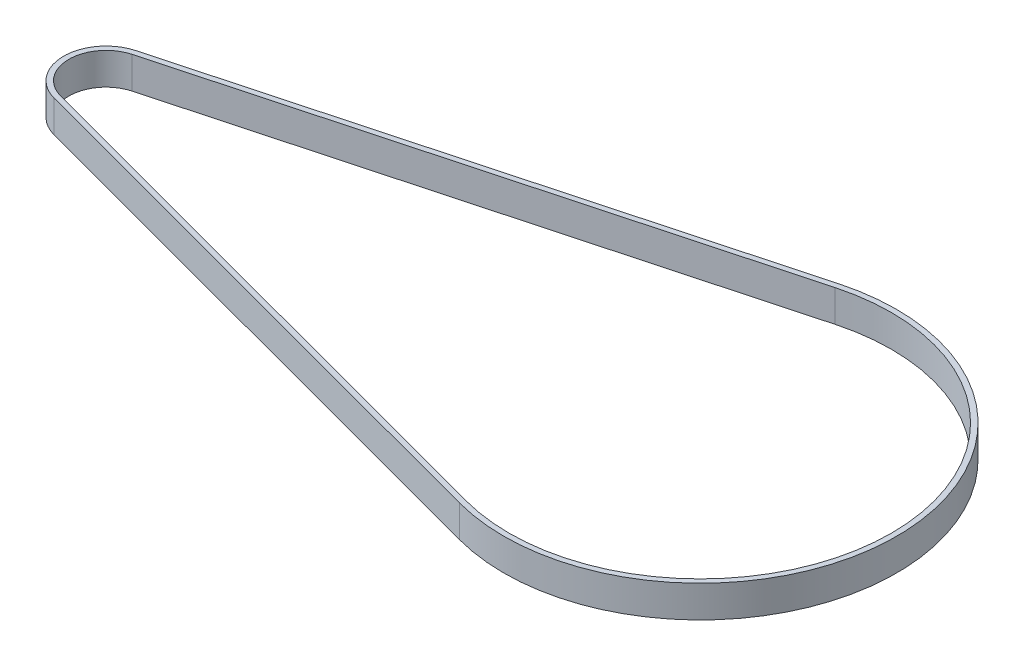
ISO-10303-21;
HEADER;
FILE_DESCRIPTION(('STEP AP214'),'2;1');
FILE_NAME('part.step','',(''),(''),'','','');
FILE_SCHEMA(('AUTOMOTIVE_DESIGN { 1 0 10303 214 1 1 1 1 }'));
ENDSEC;
DATA;
#1=APPLICATION_CONTEXT('core data for automotive mechanical design processes');
#2=APPLICATION_PROTOCOL_DEFINITION('international standard','automotive_design',2000,#1);
#3=PRODUCT_CONTEXT('',#1,'mechanical');
#4=PRODUCT('Part','Part','',(#3));
#5=PRODUCT_RELATED_PRODUCT_CATEGORY('part','',(#4));
#6=PRODUCT_DEFINITION_FORMATION('','',#4);
#7=PRODUCT_DEFINITION_CONTEXT('part definition',#1,'design');
#8=PRODUCT_DEFINITION('design','',#6,#7);
#9=PRODUCT_DEFINITION_SHAPE('','',#8);
#10=(LENGTH_UNIT() NAMED_UNIT(*) SI_UNIT(.MILLI.,.METRE.));
#11=(NAMED_UNIT(*) PLANE_ANGLE_UNIT() SI_UNIT($,.RADIAN.));
#12=(NAMED_UNIT(*) SI_UNIT($,.STERADIAN.) SOLID_ANGLE_UNIT());
#13=UNCERTAINTY_MEASURE_WITH_UNIT(LENGTH_MEASURE(1.E-05),#10,'distance_accuracy_value','');
#14=(GEOMETRIC_REPRESENTATION_CONTEXT(3) GLOBAL_UNCERTAINTY_ASSIGNED_CONTEXT((#13)) GLOBAL_UNIT_ASSIGNED_CONTEXT((#10,
#11,#12)) REPRESENTATION_CONTEXT('',''));
#15=CARTESIAN_POINT('',(0.,0.,0.));
#16=DIRECTION('',(0.,0.,1.));
#17=DIRECTION('',(1.,0.,0.));
#18=AXIS2_PLACEMENT_3D('',#15,#16,#17);
#19=CARTESIAN_POINT('',(-1.54588570592854,6.,-7.7839677512394));
#20=DIRECTION('',(-0.260781956269072,0.,-0.965397726993634));
#21=DIRECTION('',(-0.965397726993634,0.,0.260781956269072));
#22=AXIS2_PLACEMENT_3D('',#19,#20,#21);
#23=PLANE('',#22);
#24=DIRECTION('',(0.965397726993634,0.,-0.260781956269072));
#25=VECTOR('',#24,1.);
#26=CARTESIAN_POINT('',(-1.54588570592854,0.,-7.7839677512394));
#27=LINE('',#26,#25);
#28=CARTESIAN_POINT('',(-1.54588570592854,0.,-7.7839677512394));
#29=VERTEX_POINT('',#28);
#30=CARTESIAN_POINT('',(102.650740529448,0.,-35.9305018340548));
#31=VERTEX_POINT('',#30);
#32=EDGE_CURVE('E157',#29,#31,#27,.T.);
#33=ORIENTED_EDGE('',*,*,#32,.F.);
#34=DIRECTION('',(0.,-1.,0.));
#35=VECTOR('',#34,1.);
#36=CARTESIAN_POINT('',(-1.54588570592854,6.,-7.7839677512394));
#37=LINE('',#36,#35);
#38=CARTESIAN_POINT('',(-1.54588570592854,6.,-7.7839677512394));
#39=VERTEX_POINT('',#38);
#40=EDGE_CURVE('E12',#39,#29,#37,.T.);
#41=ORIENTED_EDGE('',*,*,#40,.F.);
#42=DIRECTION('',(0.965397726993634,0.,-0.260781956269072));
#43=VECTOR('',#42,1.);
#44=CARTESIAN_POINT('',(-1.54588570592854,6.,-7.7839677512394));
#45=LINE('',#44,#43);
#46=CARTESIAN_POINT('',(102.650740529448,6.,-35.9305018340548));
#47=VERTEX_POINT('',#46);
#48=EDGE_CURVE('E161',#39,#47,#45,.T.);
#49=ORIENTED_EDGE('',*,*,#48,.T.);
#50=DIRECTION('',(0.,-1.,0.));
#51=VECTOR('',#50,1.);
#52=CARTESIAN_POINT('',(102.650740529448,6.,-35.9305018340548));
#53=LINE('',#52,#51);
#54=EDGE_CURVE('E64',#47,#31,#53,.T.);
#55=ORIENTED_EDGE('',*,*,#54,.T.);
#56=EDGE_LOOP('',(#33,#41,#49,#55));
#57=FACE_BOUND('',#56,.T.);
#58=ADVANCED_FACE('F61',(#57),#23,.T.);
#59=CARTESIAN_POINT('',(0.540369944224031,6.,-0.0607859352903216));
#60=DIRECTION('',(0.,-1.,0.));
#61=DIRECTION('',(0.,0.,-1.));
#62=AXIS2_PLACEMENT_3D('',#59,#60,#61);
#63=CYLINDRICAL_SURFACE('',#62,8.);
#64=CARTESIAN_POINT('',(0.540369944224031,0.,-0.0607859352903216));
#65=DIRECTION('',(0.,1.,0.));
#66=DIRECTION('',(0.,0.,1.));
#67=AXIS2_PLACEMENT_3D('',#64,#65,#66);
#68=CIRCLE('',#67,8.);
#69=CARTESIAN_POINT('',(-1.52514657870649,0.,7.66796826532319));
#70=VERTEX_POINT('',#69);
#71=EDGE_CURVE('E165',#29,#70,#68,.T.);
#72=ORIENTED_EDGE('',*,*,#71,.T.);
#73=DIRECTION('',(0.,-1.,0.));
#74=VECTOR('',#73,1.);
#75=CARTESIAN_POINT('',(-1.52514657870649,6.,7.66796826532319));
#76=LINE('',#75,#74);
#77=CARTESIAN_POINT('',(-1.52514657870649,6.,7.66796826532319));
#78=VERTEX_POINT('',#77);
#79=EDGE_CURVE('E69',#78,#70,#76,.T.);
#80=ORIENTED_EDGE('',*,*,#79,.F.);
#81=CARTESIAN_POINT('',(0.540369944224031,6.,-0.0607859352903216));
#82=DIRECTION('',(0.,1.,0.));
#83=DIRECTION('',(0.,0.,1.));
#84=AXIS2_PLACEMENT_3D('',#81,#82,#83);
#85=CIRCLE('',#84,8.);
#86=EDGE_CURVE('E169',#39,#78,#85,.T.);
#87=ORIENTED_EDGE('',*,*,#86,.F.);
#88=ORIENTED_EDGE('',*,*,#40,.T.);
#89=EDGE_LOOP('',(#72,#80,#87,#88));
#90=FACE_BOUND('',#89,.T.);
#91=ADVANCED_FACE('F197',(#90),#63,.T.);
#92=CARTESIAN_POINT('',(-1.52514657870649,6.,7.6679682653232));
#93=DIRECTION('',(0.258189565366314,0.,-0.966094275076689));
#94=DIRECTION('',(-0.966094275076689,0.,-0.258189565366314));
#95=AXIS2_PLACEMENT_3D('',#92,#93,#94);
#96=PLANE('',#95);
#97=DIRECTION('',(0.966094275076689,0.,0.258189565366314));
#98=VECTOR('',#97,1.);
#99=CARTESIAN_POINT('',(-1.52514657870649,0.,7.6679682653232));
#100=LINE('',#99,#98);
#101=CARTESIAN_POINT('',(102.74665899285,0.,35.5347022425471));
#102=VERTEX_POINT('',#101);
#103=EDGE_CURVE('E176',#70,#102,#100,.T.);
#104=ORIENTED_EDGE('',*,*,#103,.T.);
#105=DIRECTION('',(0.,-1.,0.));
#106=VECTOR('',#105,1.);
#107=CARTESIAN_POINT('',(102.74665899285,6.,35.5347022425471));
#108=LINE('',#107,#106);
#109=CARTESIAN_POINT('',(102.74665899285,6.,35.5347022425471));
#110=VERTEX_POINT('',#109);
#111=EDGE_CURVE('E180',#110,#102,#108,.T.);
#112=ORIENTED_EDGE('',*,*,#111,.F.);
#113=DIRECTION('',(0.966094275076689,0.,0.258189565366314));
#114=VECTOR('',#113,1.);
#115=CARTESIAN_POINT('',(-1.52514657870649,6.,7.6679682653232));
#116=LINE('',#115,#114);
#117=EDGE_CURVE('E167',#78,#110,#116,.T.);
#118=ORIENTED_EDGE('',*,*,#117,.F.);
#119=ORIENTED_EDGE('',*,*,#79,.T.);
#120=EDGE_LOOP('',(#104,#112,#118,#119));
#121=FACE_BOUND('',#120,.T.);
#122=ADVANCED_FACE('F201',(#121),#96,.F.);
#123=CARTESIAN_POINT('',(112.299672911404,6.,-0.210785935290347));
#124=DIRECTION('',(0.,-1.,0.));
#125=DIRECTION('',(0.,0.,-1.));
#126=AXIS2_PLACEMENT_3D('',#123,#124,#125);
#127=CYLINDRICAL_SURFACE('',#126,37.);
#128=CARTESIAN_POINT('',(112.299672911404,0.,-0.210785935290347));
#129=DIRECTION('',(0.,1.,0.));
#130=DIRECTION('',(0.,0.,1.));
#131=AXIS2_PLACEMENT_3D('',#128,#129,#130);
#132=CIRCLE('',#131,37.);
#133=EDGE_CURVE('E173',#102,#31,#132,.T.);
#134=ORIENTED_EDGE('',*,*,#133,.T.);
#135=ORIENTED_EDGE('',*,*,#54,.F.);
#136=CARTESIAN_POINT('',(112.299672911404,6.,-0.210785935290347));
#137=DIRECTION('',(0.,1.,0.));
#138=DIRECTION('',(0.,0.,1.));
#139=AXIS2_PLACEMENT_3D('',#136,#137,#138);
#140=CIRCLE('',#139,37.);
#141=EDGE_CURVE('E164',#110,#47,#140,.T.);
#142=ORIENTED_EDGE('',*,*,#141,.F.);
#143=ORIENTED_EDGE('',*,*,#111,.T.);
#144=EDGE_LOOP('',(#134,#135,#142,#143));
#145=FACE_BOUND('',#144,.T.);
#146=ADVANCED_FACE('F190',(#145),#127,.T.);
#147=CARTESIAN_POINT('',(112.299672911404,6.,-0.210785935290347));
#148=DIRECTION('',(0.,1.,0.));
#149=DIRECTION('',(0.,0.,1.));
#150=AXIS2_PLACEMENT_3D('',#147,#148,#149);
#151=PLANE('',#150);
#152=DIRECTION('',(0.965397726993635,0.,-0.260781956269071));
#153=VECTOR('',#152,1.);
#154=CARTESIAN_POINT('',(-1.28510374965947,6.,-6.81857002424577));
#155=LINE('',#154,#153);
#156=CARTESIAN_POINT('',(-1.28510374965947,6.,-6.81857002424577));
#157=VERTEX_POINT('',#156);
#158=CARTESIAN_POINT('',(102.911522485717,6.,-34.9651041070612));
#159=VERTEX_POINT('',#158);
#160=EDGE_CURVE('E133',#157,#159,#155,.T.);
#161=ORIENTED_EDGE('',*,*,#160,.T.);
#162=CARTESIAN_POINT('',(112.299672911404,6.,-0.210785935290347));
#163=DIRECTION('',(0.,1.,0.));
#164=DIRECTION('',(0.,0.,1.));
#165=AXIS2_PLACEMENT_3D('',#162,#163,#164);
#166=CIRCLE('',#165,36.);
#167=CARTESIAN_POINT('',(103.004848558217,6.,34.5686079674704));
#168=VERTEX_POINT('',#167);
#169=EDGE_CURVE('E125',#168,#159,#166,.T.);
#170=ORIENTED_EDGE('',*,*,#169,.F.);
#171=DIRECTION('',(0.966094275076689,0.,0.258189565366314));
#172=VECTOR('',#171,1.);
#173=CARTESIAN_POINT('',(-1.26695701334017,6.,6.70187399024651));
#174=LINE('',#173,#172);
#175=CARTESIAN_POINT('',(-1.26695701334017,6.,6.70187399024651));
#176=VERTEX_POINT('',#175);
#177=EDGE_CURVE('E132',#176,#168,#174,.T.);
#178=ORIENTED_EDGE('',*,*,#177,.F.);
#179=CARTESIAN_POINT('',(0.540369944224031,6.,-0.0607859352903216));
#180=DIRECTION('',(0.,1.,0.));
#181=DIRECTION('',(0.,0.,1.));
#182=AXIS2_PLACEMENT_3D('',#179,#180,#181);
#183=CIRCLE('',#182,7.);
#184=EDGE_CURVE('E138',#157,#176,#183,.T.);
#185=ORIENTED_EDGE('',*,*,#184,.F.);
#186=EDGE_LOOP('',(#161,#170,#178,#185));
#187=FACE_BOUND('',#186,.T.);
#188=ORIENTED_EDGE('',*,*,#48,.F.);
#189=ORIENTED_EDGE('',*,*,#86,.T.);
#190=ORIENTED_EDGE('',*,*,#117,.T.);
#191=ORIENTED_EDGE('',*,*,#141,.T.);
#192=EDGE_LOOP('',(#188,#189,#190,#191));
#193=FACE_BOUND('',#192,.T.);
#194=ADVANCED_FACE('F140',(#187,#193),#151,.T.);
#195=CARTESIAN_POINT('',(112.299672911404,0.,-0.210785935290347));
#196=DIRECTION('',(0.,1.,0.));
#197=DIRECTION('',(0.,0.,1.));
#198=AXIS2_PLACEMENT_3D('',#195,#196,#197);
#199=PLANE('',#198);
#200=CARTESIAN_POINT('',(112.299672911404,0.,-0.210785935290347));
#201=DIRECTION('',(0.,1.,0.));
#202=DIRECTION('',(0.,0.,1.));
#203=AXIS2_PLACEMENT_3D('',#200,#201,#202);
#204=CIRCLE('',#203,36.);
#205=CARTESIAN_POINT('',(103.004848558217,0.,34.5686079674705));
#206=VERTEX_POINT('',#205);
#207=CARTESIAN_POINT('',(102.911522485717,0.,-34.9651041070612));
#208=VERTEX_POINT('',#207);
#209=EDGE_CURVE('E151',#206,#208,#204,.T.);
#210=ORIENTED_EDGE('',*,*,#209,.T.);
#211=DIRECTION('',(0.965397726993635,0.,-0.260781956269071));
#212=VECTOR('',#211,1.);
#213=CARTESIAN_POINT('',(-1.28510374965947,0.,-6.81857002424577));
#214=LINE('',#213,#212);
#215=CARTESIAN_POINT('',(-1.28510374965947,0.,-6.81857002424577));
#216=VERTEX_POINT('',#215);
#217=EDGE_CURVE('E85',#216,#208,#214,.T.);
#218=ORIENTED_EDGE('',*,*,#217,.F.);
#219=CARTESIAN_POINT('',(0.540369944224031,0.,-0.0607859352903216));
#220=DIRECTION('',(0.,1.,0.));
#221=DIRECTION('',(0.,0.,1.));
#222=AXIS2_PLACEMENT_3D('',#219,#220,#221);
#223=CIRCLE('',#222,7.);
#224=CARTESIAN_POINT('',(-1.26695701334017,0.,6.70187399024651));
#225=VERTEX_POINT('',#224);
#226=EDGE_CURVE('E142',#216,#225,#223,.T.);
#227=ORIENTED_EDGE('',*,*,#226,.T.);
#228=DIRECTION('',(0.966094275076689,0.,0.258189565366314));
#229=VECTOR('',#228,1.);
#230=CARTESIAN_POINT('',(-1.26695701334017,0.,6.70187399024651));
#231=LINE('',#230,#229);
#232=EDGE_CURVE('E145',#225,#206,#231,.T.);
#233=ORIENTED_EDGE('',*,*,#232,.T.);
#234=EDGE_LOOP('',(#210,#218,#227,#233));
#235=FACE_BOUND('',#234,.T.);
#236=ORIENTED_EDGE('',*,*,#32,.T.);
#237=ORIENTED_EDGE('',*,*,#133,.F.);
#238=ORIENTED_EDGE('',*,*,#103,.F.);
#239=ORIENTED_EDGE('',*,*,#71,.F.);
#240=EDGE_LOOP('',(#236,#237,#238,#239));
#241=FACE_BOUND('',#240,.T.);
#242=ADVANCED_FACE('F194',(#235,#241),#199,.F.);
#243=CARTESIAN_POINT('',(-1.28510374965947,6.,-6.81857002424577));
#244=DIRECTION('',(-0.260781956269071,0.,-0.965397726993634));
#245=DIRECTION('',(-0.965397726993635,0.,0.260781956269071));
#246=AXIS2_PLACEMENT_3D('',#243,#244,#245);
#247=PLANE('',#246);
#248=ORIENTED_EDGE('',*,*,#217,.T.);
#249=DIRECTION('',(0.,-1.,0.));
#250=VECTOR('',#249,1.);
#251=CARTESIAN_POINT('',(102.911522485717,6.,-34.9651041070612));
#252=LINE('',#251,#250);
#253=EDGE_CURVE('E127',#159,#208,#252,.T.);
#254=ORIENTED_EDGE('',*,*,#253,.F.);
#255=ORIENTED_EDGE('',*,*,#160,.F.);
#256=DIRECTION('',(0.,-1.,0.));
#257=VECTOR('',#256,1.);
#258=CARTESIAN_POINT('',(-1.28510374965947,6.,-6.81857002424577));
#259=LINE('',#258,#257);
#260=EDGE_CURVE('E155',#157,#216,#259,.T.);
#261=ORIENTED_EDGE('',*,*,#260,.T.);
#262=EDGE_LOOP('',(#248,#254,#255,#261));
#263=FACE_BOUND('',#262,.T.);
#264=ADVANCED_FACE('F136',(#263),#247,.F.);
#265=CARTESIAN_POINT('',(0.540369944224031,6.,-0.0607859352903216));
#266=DIRECTION('',(0.,-1.,0.));
#267=DIRECTION('',(0.,0.,-1.));
#268=AXIS2_PLACEMENT_3D('',#265,#266,#267);
#269=CYLINDRICAL_SURFACE('',#268,7.);
#270=ORIENTED_EDGE('',*,*,#226,.F.);
#271=ORIENTED_EDGE('',*,*,#260,.F.);
#272=ORIENTED_EDGE('',*,*,#184,.T.);
#273=DIRECTION('',(0.,-1.,0.));
#274=VECTOR('',#273,1.);
#275=CARTESIAN_POINT('',(-1.26695701334017,6.,6.70187399024651));
#276=LINE('',#275,#274);
#277=EDGE_CURVE('E158',#176,#225,#276,.T.);
#278=ORIENTED_EDGE('',*,*,#277,.T.);
#279=EDGE_LOOP('',(#270,#271,#272,#278));
#280=FACE_BOUND('',#279,.T.);
#281=ADVANCED_FACE('F245',(#280),#269,.F.);
#282=CARTESIAN_POINT('',(-1.26695701334017,6.,6.70187399024651));
#283=DIRECTION('',(0.258189565366314,0.,-0.966094275076689));
#284=DIRECTION('',(-0.966094275076689,0.,-0.258189565366314));
#285=AXIS2_PLACEMENT_3D('',#282,#283,#284);
#286=PLANE('',#285);
#287=ORIENTED_EDGE('',*,*,#232,.F.);
#288=ORIENTED_EDGE('',*,*,#277,.F.);
#289=ORIENTED_EDGE('',*,*,#177,.T.);
#290=DIRECTION('',(0.,-1.,0.));
#291=VECTOR('',#290,1.);
#292=CARTESIAN_POINT('',(103.004848558217,6.,34.5686079674705));
#293=LINE('',#292,#291);
#294=EDGE_CURVE('E77',#168,#206,#293,.T.);
#295=ORIENTED_EDGE('',*,*,#294,.T.);
#296=EDGE_LOOP('',(#287,#288,#289,#295));
#297=FACE_BOUND('',#296,.T.);
#298=ADVANCED_FACE('F253',(#297),#286,.T.);
#299=CARTESIAN_POINT('',(112.299672911404,6.,-0.210785935290347));
#300=DIRECTION('',(0.,-1.,0.));
#301=DIRECTION('',(0.,0.,-1.));
#302=AXIS2_PLACEMENT_3D('',#299,#300,#301);
#303=CYLINDRICAL_SURFACE('',#302,36.);
#304=ORIENTED_EDGE('',*,*,#209,.F.);
#305=ORIENTED_EDGE('',*,*,#294,.F.);
#306=ORIENTED_EDGE('',*,*,#169,.T.);
#307=ORIENTED_EDGE('',*,*,#253,.T.);
#308=EDGE_LOOP('',(#304,#305,#306,#307));
#309=FACE_BOUND('',#308,.T.);
#310=ADVANCED_FACE('F126',(#309),#303,.F.);
#311=CLOSED_SHELL('',(#58,#91,#122,#146,#194,#242,#264,#281,#298,#310));
#312=MANIFOLD_SOLID_BREP('B2',#311);
#313=ADVANCED_BREP_SHAPE_REPRESENTATION('',(#18,#312),#14);
#314=SHAPE_DEFINITION_REPRESENTATION(#9,#313);
ENDSEC;
END-ISO-10303-21;
